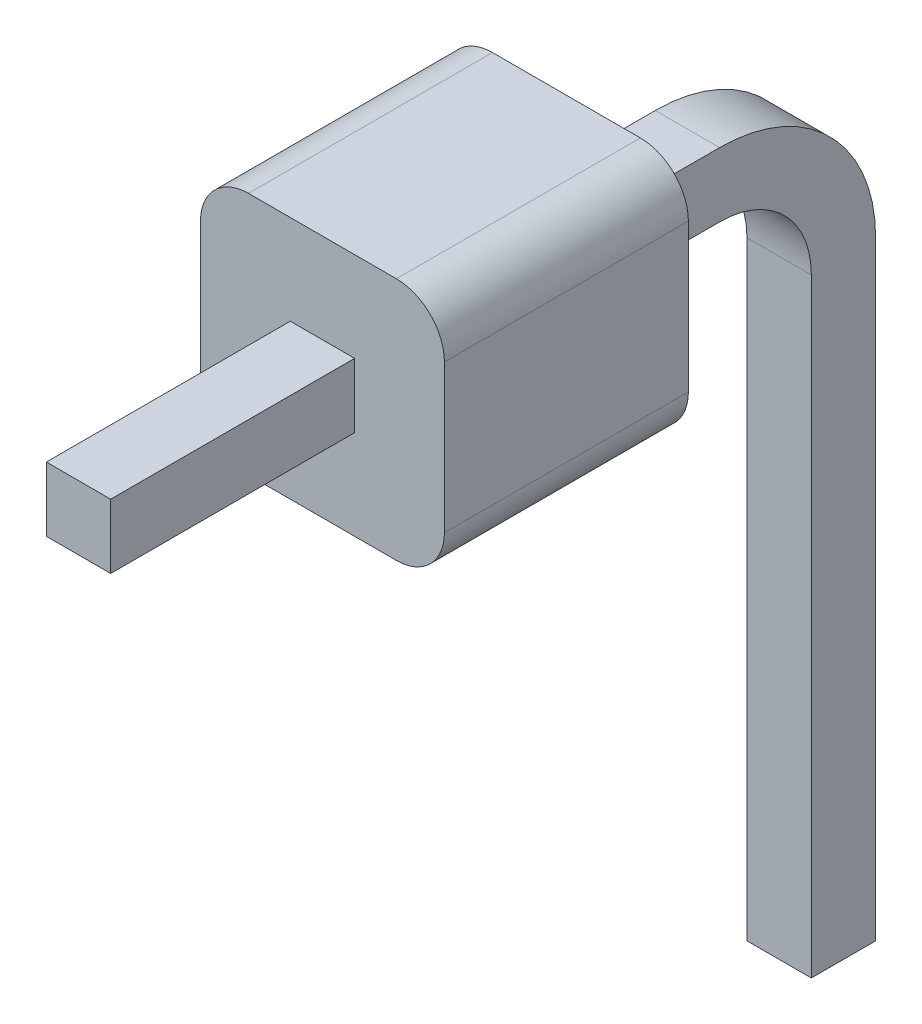
ISO-10303-21;
HEADER;
FILE_DESCRIPTION(('STEP AP214'),'2;1');
FILE_NAME('part.step','',(''),(''),'','','');
FILE_SCHEMA(('AUTOMOTIVE_DESIGN { 1 0 10303 214 1 1 1 1 }'));
ENDSEC;
DATA;
#1=APPLICATION_CONTEXT('core data for automotive mechanical design processes');
#2=APPLICATION_PROTOCOL_DEFINITION('international standard','automotive_design',2000,#1);
#3=PRODUCT_CONTEXT('',#1,'mechanical');
#4=PRODUCT('Part','Part','',(#3));
#5=PRODUCT_RELATED_PRODUCT_CATEGORY('part','',(#4));
#6=PRODUCT_DEFINITION_FORMATION('','',#4);
#7=PRODUCT_DEFINITION_CONTEXT('part definition',#1,'design');
#8=PRODUCT_DEFINITION('design','',#6,#7);
#9=PRODUCT_DEFINITION_SHAPE('','',#8);
#10=(LENGTH_UNIT() NAMED_UNIT(*) SI_UNIT(.MILLI.,.METRE.));
#11=(NAMED_UNIT(*) PLANE_ANGLE_UNIT() SI_UNIT($,.RADIAN.));
#12=(NAMED_UNIT(*) SI_UNIT($,.STERADIAN.) SOLID_ANGLE_UNIT());
#13=UNCERTAINTY_MEASURE_WITH_UNIT(LENGTH_MEASURE(1.E-05),#10,'distance_accuracy_value','');
#14=(GEOMETRIC_REPRESENTATION_CONTEXT(3) GLOBAL_UNCERTAINTY_ASSIGNED_CONTEXT((#13)) GLOBAL_UNIT_ASSIGNED_CONTEXT((#10,
#11,#12)) REPRESENTATION_CONTEXT('',''));
#15=CARTESIAN_POINT('',(0.,0.,0.));
#16=DIRECTION('',(0.,0.,1.));
#17=DIRECTION('',(1.,0.,0.));
#18=AXIS2_PLACEMENT_3D('',#15,#16,#17);
#19=CARTESIAN_POINT('',(-1.27,-0.0190907262086213,2.54));
#20=DIRECTION('',(0.,0.,1.));
#21=DIRECTION('',(1.,0.,0.));
#22=AXIS2_PLACEMENT_3D('',#19,#20,#21);
#23=PLANE('',#22);
#24=DIRECTION('',(1.,0.,0.));
#25=VECTOR('',#24,1.);
#26=CARTESIAN_POINT('',(-1.27,-2.55909072620862,2.54));
#27=LINE('',#26,#25);
#28=CARTESIAN_POINT('',(-0.769999999999999,-2.55909072620862,2.54));
#29=VERTEX_POINT('',#28);
#30=CARTESIAN_POINT('',(0.770000000000001,-2.55909072620862,2.54));
#31=VERTEX_POINT('',#30);
#32=EDGE_CURVE('E286',#29,#31,#27,.T.);
#33=ORIENTED_EDGE('',*,*,#32,.T.);
#34=CARTESIAN_POINT('',(0.770000000000001,-2.05909072620862,2.54));
#35=DIRECTION('',(0.,0.,1.));
#36=DIRECTION('',(1.,0.,0.));
#37=AXIS2_PLACEMENT_3D('',#34,#35,#36);
#38=CIRCLE('',#37,0.5);
#39=CARTESIAN_POINT('',(1.27,-2.05909072620862,2.54));
#40=VERTEX_POINT('',#39);
#41=EDGE_CURVE('E328',#31,#40,#38,.T.);
#42=ORIENTED_EDGE('',*,*,#41,.T.);
#43=DIRECTION('',(0.,1.,0.));
#44=VECTOR('',#43,1.);
#45=CARTESIAN_POINT('',(1.27,-0.019090726208621,2.54));
#46=LINE('',#45,#44);
#47=CARTESIAN_POINT('',(1.27,-0.519090726208621,2.54));
#48=VERTEX_POINT('',#47);
#49=EDGE_CURVE('E289',#40,#48,#46,.T.);
#50=ORIENTED_EDGE('',*,*,#49,.T.);
#51=CARTESIAN_POINT('',(0.770000000000001,-0.519090726208621,2.54));
#52=DIRECTION('',(0.,0.,1.));
#53=DIRECTION('',(1.,0.,0.));
#54=AXIS2_PLACEMENT_3D('',#51,#52,#53);
#55=CIRCLE('',#54,0.5);
#56=CARTESIAN_POINT('',(0.770000000000001,-0.019090726208621,2.54));
#57=VERTEX_POINT('',#56);
#58=EDGE_CURVE('E56',#48,#57,#55,.T.);
#59=ORIENTED_EDGE('',*,*,#58,.T.);
#60=DIRECTION('',(-1.,0.,0.));
#61=VECTOR('',#60,1.);
#62=CARTESIAN_POINT('',(-1.27,-0.0190907262086213,2.54));
#63=LINE('',#62,#61);
#64=CARTESIAN_POINT('',(-0.77,-0.0190907262086212,2.54));
#65=VERTEX_POINT('',#64);
#66=EDGE_CURVE('E291',#57,#65,#63,.T.);
#67=ORIENTED_EDGE('',*,*,#66,.T.);
#68=CARTESIAN_POINT('',(-0.769999999999999,-0.519090726208621,2.54));
#69=DIRECTION('',(0.,0.,1.));
#70=DIRECTION('',(1.,0.,0.));
#71=AXIS2_PLACEMENT_3D('',#68,#69,#70);
#72=CIRCLE('',#71,0.5);
#73=CARTESIAN_POINT('',(-1.27,-0.519090726208621,2.54));
#74=VERTEX_POINT('',#73);
#75=EDGE_CURVE('E324',#65,#74,#72,.T.);
#76=ORIENTED_EDGE('',*,*,#75,.T.);
#77=DIRECTION('',(0.,-1.,0.));
#78=VECTOR('',#77,1.);
#79=CARTESIAN_POINT('',(-1.27,-0.0190907262086213,2.54));
#80=LINE('',#79,#78);
#81=CARTESIAN_POINT('',(-1.27,-2.05909072620862,2.54));
#82=VERTEX_POINT('',#81);
#83=EDGE_CURVE('E283',#74,#82,#80,.T.);
#84=ORIENTED_EDGE('',*,*,#83,.T.);
#85=CARTESIAN_POINT('',(-0.769999999999999,-2.05909072620862,2.54));
#86=DIRECTION('',(0.,0.,1.));
#87=DIRECTION('',(1.,0.,0.));
#88=AXIS2_PLACEMENT_3D('',#85,#86,#87);
#89=CIRCLE('',#88,0.5);
#90=EDGE_CURVE('E326',#82,#29,#89,.T.);
#91=ORIENTED_EDGE('',*,*,#90,.T.);
#92=EDGE_LOOP('',(#33,#42,#50,#59,#67,#76,#84,#91));
#93=FACE_BOUND('',#92,.T.);
#94=DIRECTION('',(1.,0.,0.));
#95=VECTOR('',#94,1.);
#96=CARTESIAN_POINT('',(-1.27,-0.954090726208621,2.54));
#97=LINE('',#96,#95);
#98=CARTESIAN_POINT('',(-0.335,-0.954090726208621,2.54));
#99=VERTEX_POINT('',#98);
#100=CARTESIAN_POINT('',(0.335,-0.954090726208621,2.54));
#101=VERTEX_POINT('',#100);
#102=EDGE_CURVE('E263',#99,#101,#97,.T.);
#103=ORIENTED_EDGE('',*,*,#102,.T.);
#104=DIRECTION('',(0.,-1.,0.));
#105=VECTOR('',#104,1.);
#106=CARTESIAN_POINT('',(0.335000000000001,-0.0190907262086233,2.54));
#107=LINE('',#106,#105);
#108=CARTESIAN_POINT('',(0.334999999999999,-1.62409072620862,2.54));
#109=VERTEX_POINT('',#108);
#110=EDGE_CURVE('E270',#101,#109,#107,.T.);
#111=ORIENTED_EDGE('',*,*,#110,.T.);
#112=DIRECTION('',(-1.,0.,0.));
#113=VECTOR('',#112,1.);
#114=CARTESIAN_POINT('',(-1.27,-1.62409072620862,2.54));
#115=LINE('',#114,#113);
#116=CARTESIAN_POINT('',(-0.335,-1.62409072620862,2.54));
#117=VERTEX_POINT('',#116);
#118=EDGE_CURVE('E180',#109,#117,#115,.T.);
#119=ORIENTED_EDGE('',*,*,#118,.T.);
#120=DIRECTION('',(0.,1.,0.));
#121=VECTOR('',#120,1.);
#122=CARTESIAN_POINT('',(-0.335,-0.0190907262086213,2.54));
#123=LINE('',#122,#121);
#124=EDGE_CURVE('E266',#117,#99,#123,.T.);
#125=ORIENTED_EDGE('',*,*,#124,.T.);
#126=EDGE_LOOP('',(#103,#111,#119,#125));
#127=FACE_BOUND('',#126,.T.);
#128=ADVANCED_FACE('F36',(#93,#127),#23,.T.);
#129=CARTESIAN_POINT('',(-1.27,-0.0190907262086213,0.));
#130=DIRECTION('',(0.,0.,1.));
#131=DIRECTION('',(1.,0.,0.));
#132=AXIS2_PLACEMENT_3D('',#129,#130,#131);
#133=PLANE('',#132);
#134=DIRECTION('',(0.,1.,0.));
#135=VECTOR('',#134,1.);
#136=CARTESIAN_POINT('',(1.27,-0.019090726208621,0.));
#137=LINE('',#136,#135);
#138=CARTESIAN_POINT('',(1.27,-2.05909072620862,0.));
#139=VERTEX_POINT('',#138);
#140=CARTESIAN_POINT('',(1.27,-0.519090726208621,0.));
#141=VERTEX_POINT('',#140);
#142=EDGE_CURVE('E278',#139,#141,#137,.T.);
#143=ORIENTED_EDGE('',*,*,#142,.F.);
#144=CARTESIAN_POINT('',(0.770000000000001,-2.05909072620862,0.));
#145=DIRECTION('',(0.,0.,1.));
#146=DIRECTION('',(1.,0.,0.));
#147=AXIS2_PLACEMENT_3D('',#144,#145,#146);
#148=CIRCLE('',#147,0.5);
#149=CARTESIAN_POINT('',(0.770000000000001,-2.55909072620862,0.));
#150=VERTEX_POINT('',#149);
#151=EDGE_CURVE('E316',#139,#150,#148,.F.);
#152=ORIENTED_EDGE('',*,*,#151,.T.);
#153=DIRECTION('',(1.,0.,0.));
#154=VECTOR('',#153,1.);
#155=CARTESIAN_POINT('',(-1.27,-2.55909072620862,0.));
#156=LINE('',#155,#154);
#157=CARTESIAN_POINT('',(-0.769999999999999,-2.55909072620862,0.));
#158=VERTEX_POINT('',#157);
#159=EDGE_CURVE('E275',#158,#150,#156,.T.);
#160=ORIENTED_EDGE('',*,*,#159,.F.);
#161=CARTESIAN_POINT('',(-0.769999999999999,-2.05909072620862,0.));
#162=DIRECTION('',(0.,0.,1.));
#163=DIRECTION('',(1.,0.,0.));
#164=AXIS2_PLACEMENT_3D('',#161,#162,#163);
#165=CIRCLE('',#164,0.5);
#166=CARTESIAN_POINT('',(-1.27,-2.05909072620862,0.));
#167=VERTEX_POINT('',#166);
#168=EDGE_CURVE('E314',#158,#167,#165,.F.);
#169=ORIENTED_EDGE('',*,*,#168,.T.);
#170=DIRECTION('',(0.,-1.,0.));
#171=VECTOR('',#170,1.);
#172=CARTESIAN_POINT('',(-1.27,-0.0190907262086213,0.));
#173=LINE('',#172,#171);
#174=CARTESIAN_POINT('',(-1.27,-0.519090726208621,0.));
#175=VERTEX_POINT('',#174);
#176=EDGE_CURVE('E272',#175,#167,#173,.T.);
#177=ORIENTED_EDGE('',*,*,#176,.F.);
#178=CARTESIAN_POINT('',(-0.769999999999999,-0.519090726208621,0.));
#179=DIRECTION('',(0.,0.,1.));
#180=DIRECTION('',(1.,0.,0.));
#181=AXIS2_PLACEMENT_3D('',#178,#179,#180);
#182=CIRCLE('',#181,0.5);
#183=CARTESIAN_POINT('',(-0.77,-0.0190907262086212,0.));
#184=VERTEX_POINT('',#183);
#185=EDGE_CURVE('E312',#175,#184,#182,.F.);
#186=ORIENTED_EDGE('',*,*,#185,.T.);
#187=DIRECTION('',(-1.,0.,0.));
#188=VECTOR('',#187,1.);
#189=CARTESIAN_POINT('',(-1.27,-0.0190907262086213,0.));
#190=LINE('',#189,#188);
#191=CARTESIAN_POINT('',(0.770000000000001,-0.019090726208621,0.));
#192=VERTEX_POINT('',#191);
#193=EDGE_CURVE('E281',#192,#184,#190,.T.);
#194=ORIENTED_EDGE('',*,*,#193,.F.);
#195=CARTESIAN_POINT('',(0.770000000000001,-0.519090726208621,0.));
#196=DIRECTION('',(0.,0.,1.));
#197=DIRECTION('',(1.,0.,0.));
#198=AXIS2_PLACEMENT_3D('',#195,#196,#197);
#199=CIRCLE('',#198,0.5);
#200=EDGE_CURVE('E310',#192,#141,#199,.F.);
#201=ORIENTED_EDGE('',*,*,#200,.T.);
#202=EDGE_LOOP('',(#143,#152,#160,#169,#177,#186,#194,#201));
#203=FACE_BOUND('',#202,.T.);
#204=DIRECTION('',(0.,-1.,0.));
#205=VECTOR('',#204,1.);
#206=CARTESIAN_POINT('',(0.335000000000001,-0.0190907262086233,0.));
#207=LINE('',#206,#205);
#208=CARTESIAN_POINT('',(0.335,-0.954090726208621,0.));
#209=VERTEX_POINT('',#208);
#210=CARTESIAN_POINT('',(0.334999999999999,-1.62409072620862,0.));
#211=VERTEX_POINT('',#210);
#212=EDGE_CURVE('E302',#209,#211,#207,.T.);
#213=ORIENTED_EDGE('',*,*,#212,.F.);
#214=DIRECTION('',(1.,0.,0.));
#215=VECTOR('',#214,1.);
#216=CARTESIAN_POINT('',(-1.27,-0.95409072620862,0.));
#217=LINE('',#216,#215);
#218=CARTESIAN_POINT('',(-0.335,-0.954090726208621,0.));
#219=VERTEX_POINT('',#218);
#220=EDGE_CURVE('E293',#219,#209,#217,.T.);
#221=ORIENTED_EDGE('',*,*,#220,.F.);
#222=DIRECTION('',(0.,1.,0.));
#223=VECTOR('',#222,1.);
#224=CARTESIAN_POINT('',(-0.335,-0.0190907262086213,0.));
#225=LINE('',#224,#223);
#226=CARTESIAN_POINT('',(-0.335,-1.62409072620862,0.));
#227=VERTEX_POINT('',#226);
#228=EDGE_CURVE('E296',#227,#219,#225,.T.);
#229=ORIENTED_EDGE('',*,*,#228,.F.);
#230=DIRECTION('',(-1.,0.,0.));
#231=VECTOR('',#230,1.);
#232=CARTESIAN_POINT('',(-1.27,-1.62409072620862,0.));
#233=LINE('',#232,#231);
#234=EDGE_CURVE('E299',#211,#227,#233,.T.);
#235=ORIENTED_EDGE('',*,*,#234,.F.);
#236=EDGE_LOOP('',(#213,#221,#229,#235));
#237=FACE_BOUND('',#236,.T.);
#238=ADVANCED_FACE('F341',(#203,#237),#133,.F.);
#239=CARTESIAN_POINT('',(-1.27,-0.0190907262086213,2.54));
#240=DIRECTION('',(1.,0.,0.));
#241=DIRECTION('',(0.,0.,-1.));
#242=AXIS2_PLACEMENT_3D('',#239,#240,#241);
#243=PLANE('',#242);
#244=ORIENTED_EDGE('',*,*,#176,.T.);
#245=DIRECTION('',(0.,0.,-1.));
#246=VECTOR('',#245,1.);
#247=CARTESIAN_POINT('',(-1.27,-2.05909072620862,2.54));
#248=LINE('',#247,#246);
#249=EDGE_CURVE('E333',#167,#82,#248,.F.);
#250=ORIENTED_EDGE('',*,*,#249,.T.);
#251=ORIENTED_EDGE('',*,*,#83,.F.);
#252=DIRECTION('',(0.,0.,-1.));
#253=VECTOR('',#252,1.);
#254=CARTESIAN_POINT('',(-1.27,-0.519090726208621,2.54));
#255=LINE('',#254,#253);
#256=EDGE_CURVE('E330',#74,#175,#255,.T.);
#257=ORIENTED_EDGE('',*,*,#256,.T.);
#258=EDGE_LOOP('',(#244,#250,#251,#257));
#259=FACE_BOUND('',#258,.T.);
#260=ADVANCED_FACE('F38',(#259),#243,.F.);
#261=CARTESIAN_POINT('',(-1.27,-2.55909072620862,2.54));
#262=DIRECTION('',(0.,1.,0.));
#263=DIRECTION('',(-1.,0.,0.));
#264=AXIS2_PLACEMENT_3D('',#261,#262,#263);
#265=PLANE('',#264);
#266=ORIENTED_EDGE('',*,*,#159,.T.);
#267=DIRECTION('',(0.,0.,-1.));
#268=VECTOR('',#267,1.);
#269=CARTESIAN_POINT('',(0.770000000000001,-2.55909072620862,2.54));
#270=LINE('',#269,#268);
#271=EDGE_CURVE('E321',#150,#31,#270,.F.);
#272=ORIENTED_EDGE('',*,*,#271,.T.);
#273=ORIENTED_EDGE('',*,*,#32,.F.);
#274=DIRECTION('',(0.,0.,-1.));
#275=VECTOR('',#274,1.);
#276=CARTESIAN_POINT('',(-0.769999999999999,-2.55909072620862,2.54));
#277=LINE('',#276,#275);
#278=EDGE_CURVE('E318',#29,#158,#277,.T.);
#279=ORIENTED_EDGE('',*,*,#278,.T.);
#280=EDGE_LOOP('',(#266,#272,#273,#279));
#281=FACE_BOUND('',#280,.T.);
#282=ADVANCED_FACE('F359',(#281),#265,.F.);
#283=CARTESIAN_POINT('',(1.27,-0.019090726208621,2.54));
#284=DIRECTION('',(-1.,0.,0.));
#285=DIRECTION('',(0.,0.,1.));
#286=AXIS2_PLACEMENT_3D('',#283,#284,#285);
#287=PLANE('',#286);
#288=ORIENTED_EDGE('',*,*,#49,.F.);
#289=DIRECTION('',(0.,0.,-1.));
#290=VECTOR('',#289,1.);
#291=CARTESIAN_POINT('',(1.27,-2.05909072620862,2.54));
#292=LINE('',#291,#290);
#293=EDGE_CURVE('E307',#40,#139,#292,.T.);
#294=ORIENTED_EDGE('',*,*,#293,.T.);
#295=ORIENTED_EDGE('',*,*,#142,.T.);
#296=DIRECTION('',(0.,0.,-1.));
#297=VECTOR('',#296,1.);
#298=CARTESIAN_POINT('',(1.27,-0.519090726208621,2.54));
#299=LINE('',#298,#297);
#300=EDGE_CURVE('E305',#141,#48,#299,.F.);
#301=ORIENTED_EDGE('',*,*,#300,.T.);
#302=EDGE_LOOP('',(#288,#294,#295,#301));
#303=FACE_BOUND('',#302,.T.);
#304=ADVANCED_FACE('F367',(#303),#287,.F.);
#305=CARTESIAN_POINT('',(-1.27,-0.0190907262086213,2.54));
#306=DIRECTION('',(0.,-1.,0.));
#307=DIRECTION('',(1.,0.,0.));
#308=AXIS2_PLACEMENT_3D('',#305,#306,#307);
#309=PLANE('',#308);
#310=ORIENTED_EDGE('',*,*,#193,.T.);
#311=DIRECTION('',(0.,0.,-1.));
#312=VECTOR('',#311,1.);
#313=CARTESIAN_POINT('',(-0.77,-0.0190907262086212,2.54));
#314=LINE('',#313,#312);
#315=EDGE_CURVE('E11',#184,#65,#314,.F.);
#316=ORIENTED_EDGE('',*,*,#315,.T.);
#317=ORIENTED_EDGE('',*,*,#66,.F.);
#318=DIRECTION('',(0.,0.,-1.));
#319=VECTOR('',#318,1.);
#320=CARTESIAN_POINT('',(0.770000000000001,-0.019090726208621,2.54));
#321=LINE('',#320,#319);
#322=EDGE_CURVE('E44',#57,#192,#321,.T.);
#323=ORIENTED_EDGE('',*,*,#322,.T.);
#324=EDGE_LOOP('',(#310,#316,#317,#323));
#325=FACE_BOUND('',#324,.T.);
#326=ADVANCED_FACE('F337',(#325),#309,.F.);
#327=CARTESIAN_POINT('',(0.,-2.57909072620862,-1.26));
#328=DIRECTION('',(-1.,0.,0.));
#329=DIRECTION('',(0.,0.,1.));
#330=AXIS2_PLACEMENT_3D('',#327,#328,#329);
#331=CYLINDRICAL_SURFACE('',#330,0.955000000000001);
#332=DIRECTION('',(-1.,0.,0.));
#333=VECTOR('',#332,1.);
#334=CARTESIAN_POINT('',(0.334999999999999,-1.62409072620862,-1.26));
#335=LINE('',#334,#333);
#336=CARTESIAN_POINT('',(0.334999999999999,-1.62409072620862,-1.26));
#337=VERTEX_POINT('',#336);
#338=CARTESIAN_POINT('',(-0.335,-1.62409072620862,-1.26));
#339=VERTEX_POINT('',#338);
#340=EDGE_CURVE('E204',#337,#339,#335,.T.);
#341=ORIENTED_EDGE('',*,*,#340,.T.);
#342=CARTESIAN_POINT('',(-0.335,-2.57909072620862,-1.26));
#343=DIRECTION('',(-1.,0.,0.));
#344=DIRECTION('',(0.,0.,1.));
#345=AXIS2_PLACEMENT_3D('',#342,#343,#344);
#346=CIRCLE('',#345,0.955000000000001);
#347=CARTESIAN_POINT('',(-0.335,-2.57909072620862,-2.215));
#348=VERTEX_POINT('',#347);
#349=EDGE_CURVE('E233',#339,#348,#346,.T.);
#350=ORIENTED_EDGE('',*,*,#349,.T.);
#351=DIRECTION('',(-1.,0.,0.));
#352=VECTOR('',#351,1.);
#353=CARTESIAN_POINT('',(0.334999999999999,-2.57909072620862,-2.215));
#354=LINE('',#353,#352);
#355=CARTESIAN_POINT('',(0.334999999999999,-2.57909072620862,-2.215));
#356=VERTEX_POINT('',#355);
#357=EDGE_CURVE('E224',#356,#348,#354,.T.);
#358=ORIENTED_EDGE('',*,*,#357,.F.);
#359=CARTESIAN_POINT('',(0.334999999999999,-2.57909072620862,-1.26));
#360=DIRECTION('',(-1.,0.,0.));
#361=DIRECTION('',(0.,0.,1.));
#362=AXIS2_PLACEMENT_3D('',#359,#360,#361);
#363=CIRCLE('',#362,0.955000000000001);
#364=EDGE_CURVE('E236',#337,#356,#363,.T.);
#365=ORIENTED_EDGE('',*,*,#364,.F.);
#366=EDGE_LOOP('',(#341,#350,#358,#365));
#367=FACE_BOUND('',#366,.T.);
#368=ADVANCED_FACE('F386',(#367),#331,.F.);
#369=CARTESIAN_POINT('',(0.334999999999999,-2.57909072620862,-2.215));
#370=DIRECTION('',(0.,0.,1.));
#371=DIRECTION('',(0.,-1.,0.));
#372=AXIS2_PLACEMENT_3D('',#369,#370,#371);
#373=PLANE('',#372);
#374=ORIENTED_EDGE('',*,*,#357,.T.);
#375=DIRECTION('',(0.,-1.,0.));
#376=VECTOR('',#375,1.);
#377=CARTESIAN_POINT('',(-0.335,-2.57909072620862,-2.215));
#378=LINE('',#377,#376);
#379=CARTESIAN_POINT('',(-0.335,-8.91909072620862,-2.215));
#380=VERTEX_POINT('',#379);
#381=EDGE_CURVE('E257',#348,#380,#378,.T.);
#382=ORIENTED_EDGE('',*,*,#381,.T.);
#383=DIRECTION('',(-1.,0.,0.));
#384=VECTOR('',#383,1.);
#385=CARTESIAN_POINT('',(0.334999999999999,-8.91909072620862,-2.215));
#386=LINE('',#385,#384);
#387=CARTESIAN_POINT('',(0.334999999999999,-8.91909072620862,-2.215));
#388=VERTEX_POINT('',#387);
#389=EDGE_CURVE('E248',#388,#380,#386,.T.);
#390=ORIENTED_EDGE('',*,*,#389,.F.);
#391=DIRECTION('',(0.,-1.,0.));
#392=VECTOR('',#391,1.);
#393=CARTESIAN_POINT('',(0.334999999999999,-2.57909072620862,-2.215));
#394=LINE('',#393,#392);
#395=EDGE_CURVE('E260',#356,#388,#394,.T.);
#396=ORIENTED_EDGE('',*,*,#395,.F.);
#397=EDGE_LOOP('',(#374,#382,#390,#396));
#398=FACE_BOUND('',#397,.T.);
#399=ADVANCED_FACE('F524',(#398),#373,.T.);
#400=CARTESIAN_POINT('',(0.335,-8.91909072620862,-2.885));
#401=DIRECTION('',(0.,-1.,0.));
#402=DIRECTION('',(-1.,0.,0.));
#403=AXIS2_PLACEMENT_3D('',#400,#401,#402);
#404=PLANE('',#403);
#405=DIRECTION('',(0.,0.,1.));
#406=VECTOR('',#405,1.);
#407=CARTESIAN_POINT('',(0.335,-8.91909072620862,-2.885));
#408=LINE('',#407,#406);
#409=CARTESIAN_POINT('',(0.335,-8.91909072620862,-2.885));
#410=VERTEX_POINT('',#409);
#411=EDGE_CURVE('E239',#410,#388,#408,.T.);
#412=ORIENTED_EDGE('',*,*,#411,.T.);
#413=ORIENTED_EDGE('',*,*,#389,.T.);
#414=DIRECTION('',(0.,0.,-1.));
#415=VECTOR('',#414,1.);
#416=CARTESIAN_POINT('',(-0.335,-8.91909072620862,-2.885));
#417=LINE('',#416,#415);
#418=CARTESIAN_POINT('',(-0.335,-8.91909072620862,-2.885));
#419=VERTEX_POINT('',#418);
#420=EDGE_CURVE('E245',#380,#419,#417,.T.);
#421=ORIENTED_EDGE('',*,*,#420,.T.);
#422=DIRECTION('',(1.,0.,0.));
#423=VECTOR('',#422,1.);
#424=CARTESIAN_POINT('',(0.335,-8.91909072620862,-2.885));
#425=LINE('',#424,#423);
#426=EDGE_CURVE('E242',#419,#410,#425,.T.);
#427=ORIENTED_EDGE('',*,*,#426,.T.);
#428=EDGE_LOOP('',(#412,#413,#421,#427));
#429=FACE_BOUND('',#428,.T.);
#430=ADVANCED_FACE('F514',(#429),#404,.T.);
#431=CARTESIAN_POINT('',(0.335,-2.57909072620862,-2.885));
#432=DIRECTION('',(0.,0.,-1.));
#433=DIRECTION('',(-1.,0.,0.));
#434=AXIS2_PLACEMENT_3D('',#431,#432,#433);
#435=PLANE('',#434);
#436=DIRECTION('',(1.,0.,0.));
#437=VECTOR('',#436,1.);
#438=CARTESIAN_POINT('',(0.335,-2.57909072620862,-2.885));
#439=LINE('',#438,#437);
#440=CARTESIAN_POINT('',(-0.335,-2.57909072620862,-2.885));
#441=VERTEX_POINT('',#440);
#442=CARTESIAN_POINT('',(0.335,-2.57909072620862,-2.885));
#443=VERTEX_POINT('',#442);
#444=EDGE_CURVE('E221',#441,#443,#439,.T.);
#445=ORIENTED_EDGE('',*,*,#444,.T.);
#446=DIRECTION('',(0.,-1.,0.));
#447=VECTOR('',#446,1.);
#448=CARTESIAN_POINT('',(0.335,-2.57909072620862,-2.885));
#449=LINE('',#448,#447);
#450=EDGE_CURVE('E251',#443,#410,#449,.T.);
#451=ORIENTED_EDGE('',*,*,#450,.T.);
#452=ORIENTED_EDGE('',*,*,#426,.F.);
#453=DIRECTION('',(0.,-1.,0.));
#454=VECTOR('',#453,1.);
#455=CARTESIAN_POINT('',(-0.335,-2.57909072620862,-2.885));
#456=LINE('',#455,#454);
#457=EDGE_CURVE('E254',#441,#419,#456,.T.);
#458=ORIENTED_EDGE('',*,*,#457,.F.);
#459=EDGE_LOOP('',(#445,#451,#452,#458));
#460=FACE_BOUND('',#459,.T.);
#461=ADVANCED_FACE('F504',(#460),#435,.T.);
#462=CARTESIAN_POINT('',(0.,-2.57909072620862,-1.26));
#463=DIRECTION('',(-1.,0.,0.));
#464=DIRECTION('',(0.,0.,1.));
#465=AXIS2_PLACEMENT_3D('',#462,#463,#464);
#466=CYLINDRICAL_SURFACE('',#465,1.625);
#467=DIRECTION('',(1.,0.,0.));
#468=VECTOR('',#467,1.);
#469=CARTESIAN_POINT('',(0.335,-0.954090726208621,-1.26));
#470=LINE('',#469,#468);
#471=CARTESIAN_POINT('',(-0.335,-0.95409072620862,-1.26));
#472=VERTEX_POINT('',#471);
#473=CARTESIAN_POINT('',(0.335,-0.954090726208621,-1.26));
#474=VERTEX_POINT('',#473);
#475=EDGE_CURVE('E207',#472,#474,#470,.T.);
#476=ORIENTED_EDGE('',*,*,#475,.T.);
#477=CARTESIAN_POINT('',(0.335,-2.57909072620862,-1.26));
#478=DIRECTION('',(-1.,0.,0.));
#479=DIRECTION('',(0.,0.,1.));
#480=AXIS2_PLACEMENT_3D('',#477,#478,#479);
#481=CIRCLE('',#480,1.625);
#482=EDGE_CURVE('E227',#474,#443,#481,.T.);
#483=ORIENTED_EDGE('',*,*,#482,.T.);
#484=ORIENTED_EDGE('',*,*,#444,.F.);
#485=CARTESIAN_POINT('',(-0.335,-2.57909072620862,-1.26));
#486=DIRECTION('',(-1.,0.,0.));
#487=DIRECTION('',(0.,0.,1.));
#488=AXIS2_PLACEMENT_3D('',#485,#486,#487);
#489=CIRCLE('',#488,1.625);
#490=EDGE_CURVE('E230',#472,#441,#489,.T.);
#491=ORIENTED_EDGE('',*,*,#490,.F.);
#492=EDGE_LOOP('',(#476,#483,#484,#491));
#493=FACE_BOUND('',#492,.T.);
#494=ADVANCED_FACE('F494',(#493),#466,.T.);
#495=CARTESIAN_POINT('',(0.335,-0.954090726208621,-1.26));
#496=DIRECTION('',(0.,-1.,0.));
#497=DIRECTION('',(1.,0.,0.));
#498=AXIS2_PLACEMENT_3D('',#495,#496,#497);
#499=PLANE('',#498);
#500=DIRECTION('',(0.,0.,1.));
#501=VECTOR('',#500,1.);
#502=CARTESIAN_POINT('',(-0.335,-0.95409072620862,-1.26));
#503=LINE('',#502,#501);
#504=EDGE_CURVE('E214',#472,#219,#503,.T.);
#505=ORIENTED_EDGE('',*,*,#504,.T.);
#506=ORIENTED_EDGE('',*,*,#220,.T.);
#507=DIRECTION('',(0.,0.,1.));
#508=VECTOR('',#507,1.);
#509=CARTESIAN_POINT('',(0.335,-0.954090726208621,-1.26));
#510=LINE('',#509,#508);
#511=EDGE_CURVE('E210',#474,#209,#510,.T.);
#512=ORIENTED_EDGE('',*,*,#511,.F.);
#513=ORIENTED_EDGE('',*,*,#475,.F.);
#514=EDGE_LOOP('',(#505,#506,#512,#513));
#515=FACE_BOUND('',#514,.T.);
#516=ADVANCED_FACE('F427',(#515),#499,.F.);
#517=CARTESIAN_POINT('',(-0.335,-0.95409072620862,-1.26));
#518=DIRECTION('',(1.,0.,0.));
#519=DIRECTION('',(0.,0.,-1.));
#520=AXIS2_PLACEMENT_3D('',#517,#518,#519);
#521=PLANE('',#520);
#522=DIRECTION('',(0.,0.,1.));
#523=VECTOR('',#522,1.);
#524=CARTESIAN_POINT('',(-0.335,-1.62409072620862,-1.26));
#525=LINE('',#524,#523);
#526=EDGE_CURVE('E186',#339,#227,#525,.T.);
#527=ORIENTED_EDGE('',*,*,#526,.T.);
#528=ORIENTED_EDGE('',*,*,#228,.T.);
#529=ORIENTED_EDGE('',*,*,#504,.F.);
#530=ORIENTED_EDGE('',*,*,#490,.T.);
#531=ORIENTED_EDGE('',*,*,#457,.T.);
#532=ORIENTED_EDGE('',*,*,#420,.F.);
#533=ORIENTED_EDGE('',*,*,#381,.F.);
#534=ORIENTED_EDGE('',*,*,#349,.F.);
#535=EDGE_LOOP('',(#527,#528,#529,#530,#531,#532,#533,#534));
#536=FACE_BOUND('',#535,.T.);
#537=ADVANCED_FACE('F437',(#536),#521,.F.);
#538=CARTESIAN_POINT('',(0.334999999999999,-1.62409072620862,-1.26));
#539=DIRECTION('',(0.,1.,0.));
#540=DIRECTION('',(0.,0.,1.));
#541=AXIS2_PLACEMENT_3D('',#538,#539,#540);
#542=PLANE('',#541);
#543=DIRECTION('',(0.,0.,1.));
#544=VECTOR('',#543,1.);
#545=CARTESIAN_POINT('',(0.334999999999999,-1.62409072620862,-1.26));
#546=LINE('',#545,#544);
#547=EDGE_CURVE('E185',#337,#211,#546,.T.);
#548=ORIENTED_EDGE('',*,*,#547,.T.);
#549=ORIENTED_EDGE('',*,*,#234,.T.);
#550=ORIENTED_EDGE('',*,*,#526,.F.);
#551=ORIENTED_EDGE('',*,*,#340,.F.);
#552=EDGE_LOOP('',(#548,#549,#550,#551));
#553=FACE_BOUND('',#552,.T.);
#554=ADVANCED_FACE('F447',(#553),#542,.F.);
#555=CARTESIAN_POINT('',(0.335,-0.954090726208621,-1.26));
#556=DIRECTION('',(-1.,0.,0.));
#557=DIRECTION('',(0.,-1.,0.));
#558=AXIS2_PLACEMENT_3D('',#555,#556,#557);
#559=PLANE('',#558);
#560=ORIENTED_EDGE('',*,*,#511,.T.);
#561=ORIENTED_EDGE('',*,*,#212,.T.);
#562=ORIENTED_EDGE('',*,*,#547,.F.);
#563=ORIENTED_EDGE('',*,*,#364,.T.);
#564=ORIENTED_EDGE('',*,*,#395,.T.);
#565=ORIENTED_EDGE('',*,*,#411,.F.);
#566=ORIENTED_EDGE('',*,*,#450,.F.);
#567=ORIENTED_EDGE('',*,*,#482,.F.);
#568=EDGE_LOOP('',(#560,#561,#562,#563,#564,#565,#566,#567));
#569=FACE_BOUND('',#568,.T.);
#570=ADVANCED_FACE('F456',(#569),#559,.F.);
#571=ORIENTED_EDGE('',*,*,#110,.F.);
#572=CARTESIAN_POINT('',(0.335,-0.954090726208622,5.08));
#573=VERTEX_POINT('',#572);
#574=EDGE_CURVE('E197',#101,#573,#510,.T.);
#575=ORIENTED_EDGE('',*,*,#574,.T.);
#576=DIRECTION('',(0.,-1.,0.));
#577=VECTOR('',#576,1.);
#578=CARTESIAN_POINT('',(0.335,-0.954090726208622,5.08));
#579=LINE('',#578,#577);
#580=CARTESIAN_POINT('',(0.334999999999999,-1.62409072620862,5.08));
#581=VERTEX_POINT('',#580);
#582=EDGE_CURVE('E192',#573,#581,#579,.T.);
#583=ORIENTED_EDGE('',*,*,#582,.T.);
#584=EDGE_CURVE('E173',#109,#581,#546,.T.);
#585=ORIENTED_EDGE('',*,*,#584,.F.);
#586=EDGE_LOOP('',(#571,#575,#583,#585));
#587=FACE_BOUND('',#586,.T.);
#588=ADVANCED_FACE('F196',(#587),#559,.F.);
#589=ORIENTED_EDGE('',*,*,#118,.F.);
#590=ORIENTED_EDGE('',*,*,#584,.T.);
#591=DIRECTION('',(-1.,0.,0.));
#592=VECTOR('',#591,1.);
#593=CARTESIAN_POINT('',(0.334999999999999,-1.62409072620862,5.08));
#594=LINE('',#593,#592);
#595=CARTESIAN_POINT('',(-0.335,-1.62409072620862,5.08));
#596=VERTEX_POINT('',#595);
#597=EDGE_CURVE('E177',#581,#596,#594,.T.);
#598=ORIENTED_EDGE('',*,*,#597,.T.);
#599=EDGE_CURVE('E217',#117,#596,#525,.T.);
#600=ORIENTED_EDGE('',*,*,#599,.F.);
#601=EDGE_LOOP('',(#589,#590,#598,#600));
#602=FACE_BOUND('',#601,.T.);
#603=ADVANCED_FACE('F175',(#602),#542,.F.);
#604=ORIENTED_EDGE('',*,*,#124,.F.);
#605=ORIENTED_EDGE('',*,*,#599,.T.);
#606=DIRECTION('',(0.,1.,0.));
#607=VECTOR('',#606,1.);
#608=CARTESIAN_POINT('',(-0.335,-0.954090726208621,5.08));
#609=LINE('',#608,#607);
#610=CARTESIAN_POINT('',(-0.335,-0.954090726208621,5.08));
#611=VERTEX_POINT('',#610);
#612=EDGE_CURVE('E194',#596,#611,#609,.T.);
#613=ORIENTED_EDGE('',*,*,#612,.T.);
#614=EDGE_CURVE('E213',#99,#611,#503,.T.);
#615=ORIENTED_EDGE('',*,*,#614,.F.);
#616=EDGE_LOOP('',(#604,#605,#613,#615));
#617=FACE_BOUND('',#616,.T.);
#618=ADVANCED_FACE('F424',(#617),#521,.F.);
#619=ORIENTED_EDGE('',*,*,#102,.F.);
#620=ORIENTED_EDGE('',*,*,#614,.T.);
#621=DIRECTION('',(1.,0.,0.));
#622=VECTOR('',#621,1.);
#623=CARTESIAN_POINT('',(0.335,-0.954090726208622,5.08));
#624=LINE('',#623,#622);
#625=EDGE_CURVE('E202',#611,#573,#624,.T.);
#626=ORIENTED_EDGE('',*,*,#625,.T.);
#627=ORIENTED_EDGE('',*,*,#574,.F.);
#628=EDGE_LOOP('',(#619,#620,#626,#627));
#629=FACE_BOUND('',#628,.T.);
#630=ADVANCED_FACE('F413',(#629),#499,.F.);
#631=CARTESIAN_POINT('',(0.335,-0.954090726208622,5.08));
#632=DIRECTION('',(0.,0.,-1.));
#633=DIRECTION('',(-1.,0.,0.));
#634=AXIS2_PLACEMENT_3D('',#631,#632,#633);
#635=PLANE('',#634);
#636=ORIENTED_EDGE('',*,*,#582,.F.);
#637=ORIENTED_EDGE('',*,*,#625,.F.);
#638=ORIENTED_EDGE('',*,*,#612,.F.);
#639=ORIENTED_EDGE('',*,*,#597,.F.);
#640=EDGE_LOOP('',(#636,#637,#638,#639));
#641=FACE_BOUND('',#640,.T.);
#642=ADVANCED_FACE('F190',(#641),#635,.F.);
#643=CARTESIAN_POINT('',(0.770000000000001,-2.05909072620862,2.54));
#644=DIRECTION('',(0.,0.,-1.));
#645=DIRECTION('',(-1.,0.,0.));
#646=AXIS2_PLACEMENT_3D('',#643,#644,#645);
#647=CYLINDRICAL_SURFACE('',#646,0.5);
#648=ORIENTED_EDGE('',*,*,#41,.F.);
#649=ORIENTED_EDGE('',*,*,#271,.F.);
#650=ORIENTED_EDGE('',*,*,#151,.F.);
#651=ORIENTED_EDGE('',*,*,#293,.F.);
#652=EDGE_LOOP('',(#648,#649,#650,#651));
#653=FACE_BOUND('',#652,.T.);
#654=ADVANCED_FACE('F364',(#653),#647,.T.);
#655=CARTESIAN_POINT('',(-0.769999999999999,-2.05909072620862,2.54));
#656=DIRECTION('',(0.,0.,-1.));
#657=DIRECTION('',(-1.,0.,0.));
#658=AXIS2_PLACEMENT_3D('',#655,#656,#657);
#659=CYLINDRICAL_SURFACE('',#658,0.5);
#660=ORIENTED_EDGE('',*,*,#90,.F.);
#661=ORIENTED_EDGE('',*,*,#249,.F.);
#662=ORIENTED_EDGE('',*,*,#168,.F.);
#663=ORIENTED_EDGE('',*,*,#278,.F.);
#664=EDGE_LOOP('',(#660,#661,#662,#663));
#665=FACE_BOUND('',#664,.T.);
#666=ADVANCED_FACE('F356',(#665),#659,.T.);
#667=CARTESIAN_POINT('',(-0.769999999999999,-0.519090726208621,2.54));
#668=DIRECTION('',(0.,0.,-1.));
#669=DIRECTION('',(-1.,0.,0.));
#670=AXIS2_PLACEMENT_3D('',#667,#668,#669);
#671=CYLINDRICAL_SURFACE('',#670,0.5);
#672=ORIENTED_EDGE('',*,*,#75,.F.);
#673=ORIENTED_EDGE('',*,*,#315,.F.);
#674=ORIENTED_EDGE('',*,*,#185,.F.);
#675=ORIENTED_EDGE('',*,*,#256,.F.);
#676=EDGE_LOOP('',(#672,#673,#674,#675));
#677=FACE_BOUND('',#676,.T.);
#678=ADVANCED_FACE('F347',(#677),#671,.T.);
#679=CARTESIAN_POINT('',(0.770000000000001,-0.519090726208621,2.54));
#680=DIRECTION('',(0.,0.,-1.));
#681=DIRECTION('',(-1.,0.,0.));
#682=AXIS2_PLACEMENT_3D('',#679,#680,#681);
#683=CYLINDRICAL_SURFACE('',#682,0.5);
#684=ORIENTED_EDGE('',*,*,#58,.F.);
#685=ORIENTED_EDGE('',*,*,#300,.F.);
#686=ORIENTED_EDGE('',*,*,#200,.F.);
#687=ORIENTED_EDGE('',*,*,#322,.F.);
#688=EDGE_LOOP('',(#684,#685,#686,#687));
#689=FACE_BOUND('',#688,.T.);
#690=ADVANCED_FACE('F369',(#689),#683,.T.);
#691=CLOSED_SHELL('',(#128,#238,#260,#282,#304,#326,#368,#399,#430,#461,#494,#516,#537,#554,
#570,#588,#603,#618,#630,#642,#654,#666,#678,#690));
#692=MANIFOLD_SOLID_BREP('B2',#691);
#693=ADVANCED_BREP_SHAPE_REPRESENTATION('',(#18,#692),#14);
#694=SHAPE_DEFINITION_REPRESENTATION(#9,#693);
ENDSEC;
END-ISO-10303-21;
